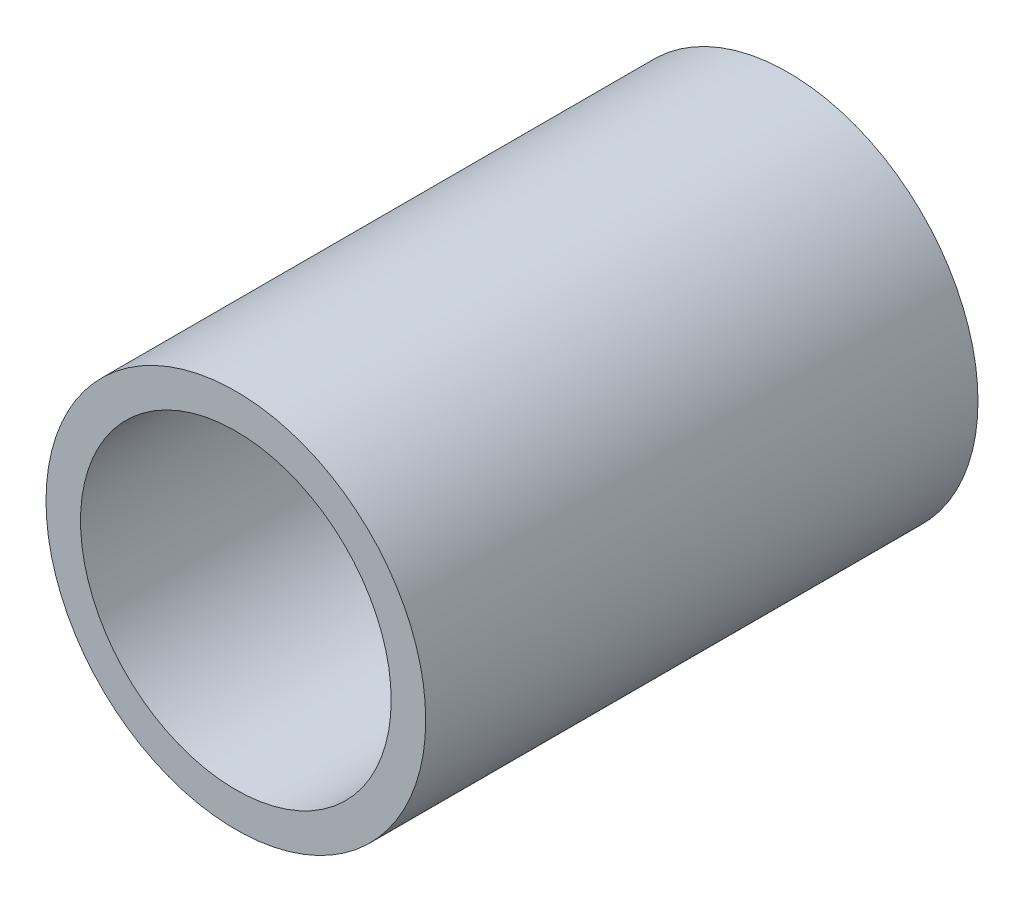
ISO-10303-21;
HEADER;
FILE_DESCRIPTION(('STEP AP214'),'2;1');
FILE_NAME('part.step','',(''),(''),'','','');
FILE_SCHEMA(('AUTOMOTIVE_DESIGN { 1 0 10303 214 1 1 1 1 }'));
ENDSEC;
DATA;
#1=APPLICATION_CONTEXT('core data for automotive mechanical design processes');
#2=APPLICATION_PROTOCOL_DEFINITION('international standard','automotive_design',2000,#1);
#3=PRODUCT_CONTEXT('',#1,'mechanical');
#4=PRODUCT('Part','Part','',(#3));
#5=PRODUCT_RELATED_PRODUCT_CATEGORY('part','',(#4));
#6=PRODUCT_DEFINITION_FORMATION('','',#4);
#7=PRODUCT_DEFINITION_CONTEXT('part definition',#1,'design');
#8=PRODUCT_DEFINITION('design','',#6,#7);
#9=PRODUCT_DEFINITION_SHAPE('','',#8);
#10=(LENGTH_UNIT() NAMED_UNIT(*) SI_UNIT(.MILLI.,.METRE.));
#11=(NAMED_UNIT(*) PLANE_ANGLE_UNIT() SI_UNIT($,.RADIAN.));
#12=(NAMED_UNIT(*) SI_UNIT($,.STERADIAN.) SOLID_ANGLE_UNIT());
#13=UNCERTAINTY_MEASURE_WITH_UNIT(LENGTH_MEASURE(1.E-05),#10,'distance_accuracy_value','');
#14=(GEOMETRIC_REPRESENTATION_CONTEXT(3) GLOBAL_UNCERTAINTY_ASSIGNED_CONTEXT((#13)) GLOBAL_UNIT_ASSIGNED_CONTEXT((#10,
#11,#12)) REPRESENTATION_CONTEXT('',''));
#15=CARTESIAN_POINT('',(0.,0.,0.));
#16=DIRECTION('',(0.,0.,1.));
#17=DIRECTION('',(1.,0.,0.));
#18=AXIS2_PLACEMENT_3D('',#15,#16,#17);
#19=CARTESIAN_POINT('',(2200.,0.,-160.));
#20=DIRECTION('',(0.,0.,1.));
#21=DIRECTION('',(1.,0.,0.));
#22=AXIS2_PLACEMENT_3D('',#19,#20,#21);
#23=CYLINDRICAL_SURFACE('',#22,110.);
#24=CARTESIAN_POINT('',(2200.,0.,-160.));
#25=DIRECTION('',(0.,0.,1.));
#26=DIRECTION('',(1.,0.,0.));
#27=AXIS2_PLACEMENT_3D('',#24,#25,#26);
#28=CIRCLE('',#27,110.);
#29=CARTESIAN_POINT('',(2310.,0.,-160.));
#30=VERTEX_POINT('',#29);
#31=EDGE_CURVE('E10',#30,#30,#28,.T.);
#32=ORIENTED_EDGE('',*,*,#31,.T.);
#33=EDGE_LOOP('',(#32));
#34=FACE_BOUND('',#33,.T.);
#35=CARTESIAN_POINT('',(2200.,0.,160.));
#36=DIRECTION('',(0.,0.,1.));
#37=DIRECTION('',(1.,0.,0.));
#38=AXIS2_PLACEMENT_3D('',#35,#36,#37);
#39=CIRCLE('',#38,110.);
#40=CARTESIAN_POINT('',(2310.,0.,160.));
#41=VERTEX_POINT('',#40);
#42=EDGE_CURVE('E49',#41,#41,#39,.T.);
#43=ORIENTED_EDGE('',*,*,#42,.F.);
#44=EDGE_LOOP('',(#43));
#45=FACE_BOUND('',#44,.T.);
#46=ADVANCED_FACE('F39',(#34,#45),#23,.T.);
#47=CARTESIAN_POINT('',(2200.,0.,-160.));
#48=DIRECTION('',(0.,0.,1.));
#49=DIRECTION('',(1.,0.,0.));
#50=AXIS2_PLACEMENT_3D('',#47,#48,#49);
#51=PLANE('',#50);
#52=CARTESIAN_POINT('',(2200.,0.,-160.));
#53=DIRECTION('',(0.,0.,1.));
#54=DIRECTION('',(1.,0.,0.));
#55=AXIS2_PLACEMENT_3D('',#52,#53,#54);
#56=CIRCLE('',#55,89.9999999999999);
#57=CARTESIAN_POINT('',(2290.,0.,-160.));
#58=VERTEX_POINT('',#57);
#59=EDGE_CURVE('E45',#58,#58,#56,.T.);
#60=ORIENTED_EDGE('',*,*,#59,.T.);
#61=EDGE_LOOP('',(#60));
#62=FACE_BOUND('',#61,.T.);
#63=ORIENTED_EDGE('',*,*,#31,.F.);
#64=EDGE_LOOP('',(#63));
#65=FACE_BOUND('',#64,.T.);
#66=ADVANCED_FACE('F68',(#62,#65),#51,.F.);
#67=CARTESIAN_POINT('',(2200.,0.,-160.));
#68=DIRECTION('',(0.,0.,1.));
#69=DIRECTION('',(1.,0.,0.));
#70=AXIS2_PLACEMENT_3D('',#67,#68,#69);
#71=CYLINDRICAL_SURFACE('',#70,89.9999999999999);
#72=ORIENTED_EDGE('',*,*,#59,.F.);
#73=EDGE_LOOP('',(#72));
#74=FACE_BOUND('',#73,.T.);
#75=CARTESIAN_POINT('',(2200.,0.,160.));
#76=DIRECTION('',(0.,0.,1.));
#77=DIRECTION('',(1.,0.,0.));
#78=AXIS2_PLACEMENT_3D('',#75,#76,#77);
#79=CIRCLE('',#78,89.9999999999999);
#80=CARTESIAN_POINT('',(2290.,0.,160.));
#81=VERTEX_POINT('',#80);
#82=EDGE_CURVE('E53',#81,#81,#79,.T.);
#83=ORIENTED_EDGE('',*,*,#82,.T.);
#84=EDGE_LOOP('',(#83));
#85=FACE_BOUND('',#84,.T.);
#86=ADVANCED_FACE('F59',(#74,#85),#71,.F.);
#87=CARTESIAN_POINT('',(2200.,0.,160.));
#88=DIRECTION('',(0.,0.,1.));
#89=DIRECTION('',(1.,0.,0.));
#90=AXIS2_PLACEMENT_3D('',#87,#88,#89);
#91=PLANE('',#90);
#92=ORIENTED_EDGE('',*,*,#42,.T.);
#93=EDGE_LOOP('',(#92));
#94=FACE_BOUND('',#93,.T.);
#95=ORIENTED_EDGE('',*,*,#82,.F.);
#96=EDGE_LOOP('',(#95));
#97=FACE_BOUND('',#96,.T.);
#98=ADVANCED_FACE('F61',(#94,#97),#91,.T.);
#99=CLOSED_SHELL('',(#46,#66,#86,#98));
#100=MANIFOLD_SOLID_BREP('B2',#99);
#101=ADVANCED_BREP_SHAPE_REPRESENTATION('',(#18,#100),#14);
#102=SHAPE_DEFINITION_REPRESENTATION(#9,#101);
ENDSEC;
END-ISO-10303-21;
